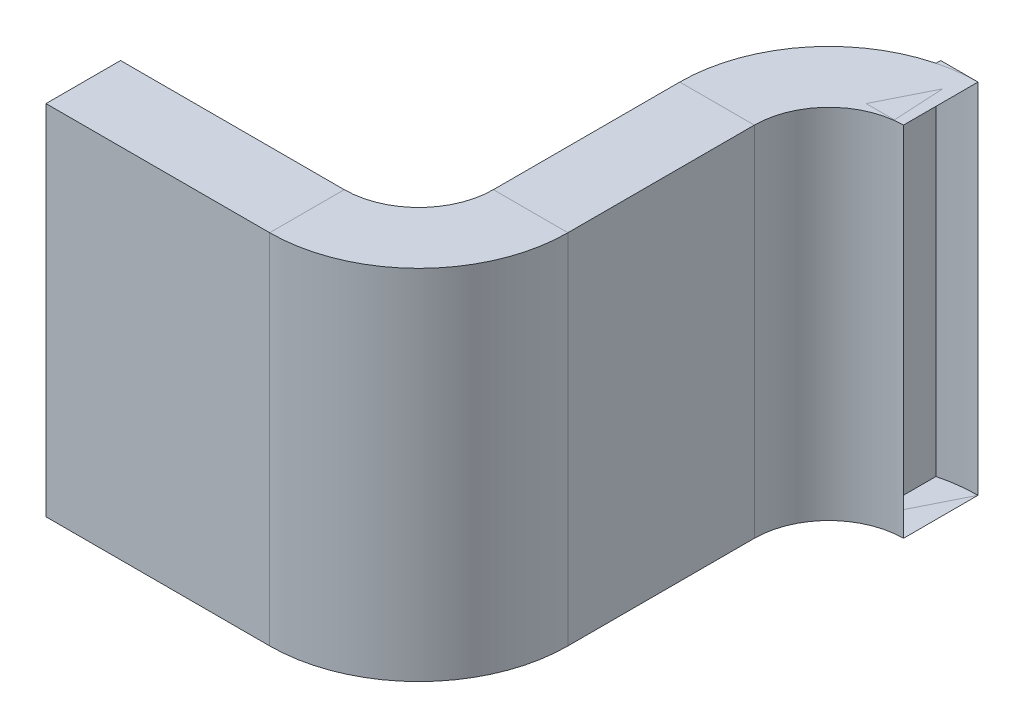
ISO-10303-21;
HEADER;
FILE_DESCRIPTION(('STEP AP214'),'2;1');
FILE_NAME('part.step','',(''),(''),'','','');
FILE_SCHEMA(('AUTOMOTIVE_DESIGN { 1 0 10303 214 1 1 1 1 }'));
ENDSEC;
DATA;
#1=APPLICATION_CONTEXT('core data for automotive mechanical design processes');
#2=APPLICATION_PROTOCOL_DEFINITION('international standard','automotive_design',2000,#1);
#3=PRODUCT_CONTEXT('',#1,'mechanical');
#4=PRODUCT('Part','Part','',(#3));
#5=PRODUCT_RELATED_PRODUCT_CATEGORY('part','',(#4));
#6=PRODUCT_DEFINITION_FORMATION('','',#4);
#7=PRODUCT_DEFINITION_CONTEXT('part definition',#1,'design');
#8=PRODUCT_DEFINITION('design','',#6,#7);
#9=PRODUCT_DEFINITION_SHAPE('','',#8);
#10=(LENGTH_UNIT() NAMED_UNIT(*) SI_UNIT(.MILLI.,.METRE.));
#11=(NAMED_UNIT(*) PLANE_ANGLE_UNIT() SI_UNIT($,.RADIAN.));
#12=(NAMED_UNIT(*) SI_UNIT($,.STERADIAN.) SOLID_ANGLE_UNIT());
#13=UNCERTAINTY_MEASURE_WITH_UNIT(LENGTH_MEASURE(1.E-05),#10,'distance_accuracy_value','');
#14=(GEOMETRIC_REPRESENTATION_CONTEXT(3) GLOBAL_UNCERTAINTY_ASSIGNED_CONTEXT((#13)) GLOBAL_UNIT_ASSIGNED_CONTEXT((#10,
#11,#12)) REPRESENTATION_CONTEXT('',''));
#15=CARTESIAN_POINT('',(0.,0.,0.));
#16=DIRECTION('',(0.,0.,1.));
#17=DIRECTION('',(1.,0.,0.));
#18=AXIS2_PLACEMENT_3D('',#15,#16,#17);
#19=CARTESIAN_POINT('',(0.55,-0.24,0.));
#20=DIRECTION('',(-1.,0.,0.));
#21=DIRECTION('',(0.,1.,0.));
#22=AXIS2_PLACEMENT_3D('',#19,#20,#21);
#23=PLANE('',#22);
#24=DIRECTION('',(0.,-1.,0.));
#25=VECTOR('',#24,1.);
#26=CARTESIAN_POINT('',(0.55,-0.24,0.));
#27=LINE('',#26,#25);
#28=CARTESIAN_POINT('',(0.55,0.24,0.));
#29=VERTEX_POINT('',#28);
#30=CARTESIAN_POINT('',(0.55,-0.24,0.));
#31=VERTEX_POINT('',#30);
#32=EDGE_CURVE('E161',#29,#31,#27,.T.);
#33=ORIENTED_EDGE('',*,*,#32,.F.);
#34=DIRECTION('',(0.,0.,-1.));
#35=VECTOR('',#34,1.);
#36=CARTESIAN_POINT('',(0.55,0.24,0.));
#37=LINE('',#36,#35);
#38=CARTESIAN_POINT('',(0.55,0.24,0.1));
#39=VERTEX_POINT('',#38);
#40=EDGE_CURVE('E11',#39,#29,#37,.T.);
#41=ORIENTED_EDGE('',*,*,#40,.F.);
#42=DIRECTION('',(0.,1.,0.));
#43=VECTOR('',#42,1.);
#44=CARTESIAN_POINT('',(0.55,0.24,0.1));
#45=LINE('',#44,#43);
#46=CARTESIAN_POINT('',(0.55,-0.24,0.1));
#47=VERTEX_POINT('',#46);
#48=EDGE_CURVE('E262',#47,#39,#45,.T.);
#49=ORIENTED_EDGE('',*,*,#48,.F.);
#50=DIRECTION('',(0.,0.,1.));
#51=VECTOR('',#50,1.);
#52=CARTESIAN_POINT('',(0.55,-0.24,0.1));
#53=LINE('',#52,#51);
#54=EDGE_CURVE('E238',#31,#47,#53,.T.);
#55=ORIENTED_EDGE('',*,*,#54,.F.);
#56=EDGE_LOOP('',(#33,#41,#49,#55));
#57=FACE_BOUND('',#56,.T.);
#58=ADVANCED_FACE('F17',(#57),#23,.F.);
#59=CARTESIAN_POINT('',(0.6,0.24,0.));
#60=DIRECTION('',(0.,1.,0.));
#61=DIRECTION('',(1.,0.,0.));
#62=AXIS2_PLACEMENT_3D('',#59,#60,#61);
#63=PLANE('',#62);
#64=ORIENTED_EDGE('',*,*,#40,.T.);
#65=DIRECTION('',(-1.,0.,0.));
#66=VECTOR('',#65,1.);
#67=CARTESIAN_POINT('',(0.6,0.24,0.));
#68=LINE('',#67,#66);
#69=CARTESIAN_POINT('',(0.6,0.24,0.));
#70=VERTEX_POINT('',#69);
#71=EDGE_CURVE('E211',#70,#29,#68,.T.);
#72=ORIENTED_EDGE('',*,*,#71,.F.);
#73=DIRECTION('',(0.,0.,-1.));
#74=VECTOR('',#73,1.);
#75=CARTESIAN_POINT('',(0.6,0.24,0.));
#76=LINE('',#75,#74);
#77=CARTESIAN_POINT('',(0.6,0.24,0.1));
#78=VERTEX_POINT('',#77);
#79=EDGE_CURVE('E21',#78,#70,#76,.T.);
#80=ORIENTED_EDGE('',*,*,#79,.F.);
#81=DIRECTION('',(-1.,0.,0.));
#82=VECTOR('',#81,1.);
#83=CARTESIAN_POINT('',(0.6,0.24,0.1));
#84=LINE('',#83,#82);
#85=EDGE_CURVE('E207',#78,#39,#84,.T.);
#86=ORIENTED_EDGE('',*,*,#85,.T.);
#87=EDGE_LOOP('',(#64,#72,#80,#86));
#88=FACE_BOUND('',#87,.T.);
#89=ADVANCED_FACE('F19',(#88),#63,.F.);
#90=CARTESIAN_POINT('',(0.493933982822,0.24,0.09393398282202));
#91=DIRECTION('',(0.,1.,0.));
#92=DIRECTION('',(1.,0.,0.));
#93=AXIS2_PLACEMENT_3D('',#90,#91,#92);
#94=PLANE('',#93);
#95=CARTESIAN_POINT('',(0.6,0.24,0.2));
#96=DIRECTION('',(0.,-1.,0.));
#97=DIRECTION('',(0.,0.,-1.));
#98=AXIS2_PLACEMENT_3D('',#95,#96,#97);
#99=CIRCLE('',#98,0.1);
#100=CARTESIAN_POINT('',(0.5,0.24,0.2));
#101=VERTEX_POINT('',#100);
#102=EDGE_CURVE('E258',#101,#78,#99,.T.);
#103=ORIENTED_EDGE('',*,*,#102,.T.);
#104=ORIENTED_EDGE('',*,*,#79,.T.);
#105=CARTESIAN_POINT('',(0.6,0.24,0.2));
#106=DIRECTION('',(0.,-1.,0.));
#107=DIRECTION('',(0.,0.,-1.));
#108=AXIS2_PLACEMENT_3D('',#105,#106,#107);
#109=CIRCLE('',#108,0.2);
#110=CARTESIAN_POINT('',(0.4,0.24,0.2));
#111=VERTEX_POINT('',#110);
#112=EDGE_CURVE('E191',#111,#70,#109,.T.);
#113=ORIENTED_EDGE('',*,*,#112,.F.);
#114=DIRECTION('',(-1.,0.,0.));
#115=VECTOR('',#114,1.);
#116=CARTESIAN_POINT('',(0.4,0.24,0.2));
#117=LINE('',#116,#115);
#118=EDGE_CURVE('E269',#101,#111,#117,.T.);
#119=ORIENTED_EDGE('',*,*,#118,.F.);
#120=EDGE_LOOP('',(#103,#104,#113,#119));
#121=FACE_BOUND('',#120,.T.);
#122=ADVANCED_FACE('F278',(#121),#94,.T.);
#123=CARTESIAN_POINT('',(0.4,0.24,0.45));
#124=DIRECTION('',(0.,-1.,0.));
#125=DIRECTION('',(0.,0.,-1.));
#126=AXIS2_PLACEMENT_3D('',#123,#124,#125);
#127=PLANE('',#126);
#128=ORIENTED_EDGE('',*,*,#118,.T.);
#129=DIRECTION('',(0.,0.,-1.));
#130=VECTOR('',#129,1.);
#131=CARTESIAN_POINT('',(0.4,0.24,0.45));
#132=LINE('',#131,#130);
#133=CARTESIAN_POINT('',(0.4,0.24,0.45));
#134=VERTEX_POINT('',#133);
#135=EDGE_CURVE('E172',#134,#111,#132,.T.);
#136=ORIENTED_EDGE('',*,*,#135,.F.);
#137=DIRECTION('',(-1.,0.,0.));
#138=VECTOR('',#137,1.);
#139=CARTESIAN_POINT('',(0.4,0.24,0.45));
#140=LINE('',#139,#138);
#141=CARTESIAN_POINT('',(0.5,0.24,0.45));
#142=VERTEX_POINT('',#141);
#143=EDGE_CURVE('E206',#142,#134,#140,.T.);
#144=ORIENTED_EDGE('',*,*,#143,.F.);
#145=DIRECTION('',(0.,0.,-1.));
#146=VECTOR('',#145,1.);
#147=CARTESIAN_POINT('',(0.5,0.24,0.45));
#148=LINE('',#147,#146);
#149=EDGE_CURVE('E251',#142,#101,#148,.T.);
#150=ORIENTED_EDGE('',*,*,#149,.T.);
#151=EDGE_LOOP('',(#128,#136,#144,#150));
#152=FACE_BOUND('',#151,.T.);
#153=ADVANCED_FACE('F346',(#152),#127,.F.);
#154=CARTESIAN_POINT('',(0.406066017178,0.24,0.556066017178));
#155=DIRECTION('',(0.,1.,0.));
#156=DIRECTION('',(1.,0.,0.));
#157=AXIS2_PLACEMENT_3D('',#154,#155,#156);
#158=PLANE('',#157);
#159=CARTESIAN_POINT('',(0.3,0.24,0.45));
#160=DIRECTION('',(0.,1.,0.));
#161=DIRECTION('',(0.,0.,-1.));
#162=AXIS2_PLACEMENT_3D('',#159,#160,#161);
#163=CIRCLE('',#162,0.2);
#164=CARTESIAN_POINT('',(0.3,0.24,0.65));
#165=VERTEX_POINT('',#164);
#166=EDGE_CURVE('E225',#165,#142,#163,.T.);
#167=ORIENTED_EDGE('',*,*,#166,.T.);
#168=ORIENTED_EDGE('',*,*,#143,.T.);
#169=CARTESIAN_POINT('',(0.3,0.24,0.45));
#170=DIRECTION('',(0.,1.,0.));
#171=DIRECTION('',(0.,0.,-1.));
#172=AXIS2_PLACEMENT_3D('',#169,#170,#171);
#173=CIRCLE('',#172,0.1);
#174=CARTESIAN_POINT('',(0.3,0.24,0.55));
#175=VERTEX_POINT('',#174);
#176=EDGE_CURVE('E178',#175,#134,#173,.T.);
#177=ORIENTED_EDGE('',*,*,#176,.F.);
#178=DIRECTION('',(0.,0.,-1.));
#179=VECTOR('',#178,1.);
#180=CARTESIAN_POINT('',(0.3,0.24,0.55));
#181=LINE('',#180,#179);
#182=EDGE_CURVE('E203',#165,#175,#181,.T.);
#183=ORIENTED_EDGE('',*,*,#182,.F.);
#184=EDGE_LOOP('',(#167,#168,#177,#183));
#185=FACE_BOUND('',#184,.T.);
#186=ADVANCED_FACE('F328',(#185),#158,.T.);
#187=CARTESIAN_POINT('',(0.,0.24,0.55));
#188=DIRECTION('',(0.,-1.,0.));
#189=DIRECTION('',(0.,0.,-1.));
#190=AXIS2_PLACEMENT_3D('',#187,#188,#189);
#191=PLANE('',#190);
#192=ORIENTED_EDGE('',*,*,#182,.T.);
#193=DIRECTION('',(1.,0.,0.));
#194=VECTOR('',#193,1.);
#195=CARTESIAN_POINT('',(0.,0.24,0.55));
#196=LINE('',#195,#194);
#197=CARTESIAN_POINT('',(0.,0.24,0.55));
#198=VERTEX_POINT('',#197);
#199=EDGE_CURVE('E295',#198,#175,#196,.T.);
#200=ORIENTED_EDGE('',*,*,#199,.F.);
#201=DIRECTION('',(0.,0.,-1.));
#202=VECTOR('',#201,1.);
#203=CARTESIAN_POINT('',(0.,0.24,0.55));
#204=LINE('',#203,#202);
#205=CARTESIAN_POINT('',(0.,0.24,0.65));
#206=VERTEX_POINT('',#205);
#207=EDGE_CURVE('E296',#206,#198,#204,.T.);
#208=ORIENTED_EDGE('',*,*,#207,.F.);
#209=DIRECTION('',(1.,0.,0.));
#210=VECTOR('',#209,1.);
#211=CARTESIAN_POINT('',(0.,0.24,0.65));
#212=LINE('',#211,#210);
#213=EDGE_CURVE('E189',#206,#165,#212,.T.);
#214=ORIENTED_EDGE('',*,*,#213,.T.);
#215=EDGE_LOOP('',(#192,#200,#208,#214));
#216=FACE_BOUND('',#215,.T.);
#217=ADVANCED_FACE('F335',(#216),#191,.F.);
#218=CARTESIAN_POINT('',(0.6,0.24,0.1));
#219=DIRECTION('',(0.,0.,1.));
#220=DIRECTION('',(1.,0.,0.));
#221=AXIS2_PLACEMENT_3D('',#218,#219,#220);
#222=PLANE('',#221);
#223=ORIENTED_EDGE('',*,*,#48,.T.);
#224=ORIENTED_EDGE('',*,*,#85,.F.);
#225=DIRECTION('',(0.,-1.,0.));
#226=VECTOR('',#225,1.);
#227=CARTESIAN_POINT('',(0.6,0.24,0.1));
#228=LINE('',#227,#226);
#229=CARTESIAN_POINT('',(0.6,-0.24,0.1));
#230=VERTEX_POINT('',#229);
#231=EDGE_CURVE('E255',#78,#230,#228,.T.);
#232=ORIENTED_EDGE('',*,*,#231,.T.);
#233=DIRECTION('',(-1.,0.,0.));
#234=VECTOR('',#233,1.);
#235=CARTESIAN_POINT('',(0.6,-0.24,0.1));
#236=LINE('',#235,#234);
#237=EDGE_CURVE('E198',#230,#47,#236,.T.);
#238=ORIENTED_EDGE('',*,*,#237,.T.);
#239=EDGE_LOOP('',(#223,#224,#232,#238));
#240=FACE_BOUND('',#239,.T.);
#241=ADVANCED_FACE('F396',(#240),#222,.F.);
#242=CARTESIAN_POINT('',(0.6,0.24,0.2));
#243=DIRECTION('',(0.,-1.,0.));
#244=DIRECTION('',(0.,0.,-1.));
#245=AXIS2_PLACEMENT_3D('',#242,#243,#244);
#246=CYLINDRICAL_SURFACE('',#245,0.1);
#247=ORIENTED_EDGE('',*,*,#231,.F.);
#248=ORIENTED_EDGE('',*,*,#102,.F.);
#249=DIRECTION('',(0.,1.,0.));
#250=VECTOR('',#249,1.);
#251=CARTESIAN_POINT('',(0.5,0.24,0.2));
#252=LINE('',#251,#250);
#253=CARTESIAN_POINT('',(0.5,-0.24,0.2));
#254=VERTEX_POINT('',#253);
#255=EDGE_CURVE('E229',#254,#101,#252,.T.);
#256=ORIENTED_EDGE('',*,*,#255,.F.);
#257=CARTESIAN_POINT('',(0.6,-0.24,0.2));
#258=DIRECTION('',(0.,-1.,0.));
#259=DIRECTION('',(0.,0.,-1.));
#260=AXIS2_PLACEMENT_3D('',#257,#258,#259);
#261=CIRCLE('',#260,0.1);
#262=EDGE_CURVE('E143',#254,#230,#261,.T.);
#263=ORIENTED_EDGE('',*,*,#262,.T.);
#264=EDGE_LOOP('',(#247,#248,#256,#263));
#265=FACE_BOUND('',#264,.T.);
#266=ADVANCED_FACE('F393',(#265),#246,.F.);
#267=CARTESIAN_POINT('',(0.5,0.24,0.45));
#268=DIRECTION('',(-1.,0.,0.));
#269=DIRECTION('',(0.,0.,1.));
#270=AXIS2_PLACEMENT_3D('',#267,#268,#269);
#271=PLANE('',#270);
#272=ORIENTED_EDGE('',*,*,#255,.T.);
#273=ORIENTED_EDGE('',*,*,#149,.F.);
#274=DIRECTION('',(0.,1.,0.));
#275=VECTOR('',#274,1.);
#276=CARTESIAN_POINT('',(0.5,0.24,0.45));
#277=LINE('',#276,#275);
#278=CARTESIAN_POINT('',(0.5,-0.24,0.45));
#279=VERTEX_POINT('',#278);
#280=EDGE_CURVE('E230',#279,#142,#277,.T.);
#281=ORIENTED_EDGE('',*,*,#280,.F.);
#282=DIRECTION('',(0.,0.,-1.));
#283=VECTOR('',#282,1.);
#284=CARTESIAN_POINT('',(0.5,-0.24,0.45));
#285=LINE('',#284,#283);
#286=EDGE_CURVE('E149',#279,#254,#285,.T.);
#287=ORIENTED_EDGE('',*,*,#286,.T.);
#288=EDGE_LOOP('',(#272,#273,#281,#287));
#289=FACE_BOUND('',#288,.T.);
#290=ADVANCED_FACE('F345',(#289),#271,.F.);
#291=CARTESIAN_POINT('',(0.3,0.24,0.45));
#292=DIRECTION('',(0.,1.,0.));
#293=DIRECTION('',(0.,0.,-1.));
#294=AXIS2_PLACEMENT_3D('',#291,#292,#293);
#295=CYLINDRICAL_SURFACE('',#294,0.2);
#296=CARTESIAN_POINT('',(0.3,-0.24,0.45));
#297=DIRECTION('',(0.,1.,0.));
#298=DIRECTION('',(0.,0.,-1.));
#299=AXIS2_PLACEMENT_3D('',#296,#297,#298);
#300=CIRCLE('',#299,0.2);
#301=CARTESIAN_POINT('',(0.3,-0.24,0.65));
#302=VERTEX_POINT('',#301);
#303=EDGE_CURVE('E150',#302,#279,#300,.T.);
#304=ORIENTED_EDGE('',*,*,#303,.T.);
#305=ORIENTED_EDGE('',*,*,#280,.T.);
#306=ORIENTED_EDGE('',*,*,#166,.F.);
#307=DIRECTION('',(0.,1.,0.));
#308=VECTOR('',#307,1.);
#309=CARTESIAN_POINT('',(0.3,0.24,0.65));
#310=LINE('',#309,#308);
#311=EDGE_CURVE('E194',#302,#165,#310,.T.);
#312=ORIENTED_EDGE('',*,*,#311,.F.);
#313=EDGE_LOOP('',(#304,#305,#306,#312));
#314=FACE_BOUND('',#313,.T.);
#315=ADVANCED_FACE('F342',(#314),#295,.T.);
#316=CARTESIAN_POINT('',(0.,0.24,0.65));
#317=DIRECTION('',(0.,0.,-1.));
#318=DIRECTION('',(0.,-1.,0.));
#319=AXIS2_PLACEMENT_3D('',#316,#317,#318);
#320=PLANE('',#319);
#321=ORIENTED_EDGE('',*,*,#311,.T.);
#322=ORIENTED_EDGE('',*,*,#213,.F.);
#323=DIRECTION('',(0.,1.,0.));
#324=VECTOR('',#323,1.);
#325=CARTESIAN_POINT('',(0.,0.24,0.65));
#326=LINE('',#325,#324);
#327=CARTESIAN_POINT('',(0.,-0.24,0.65));
#328=VERTEX_POINT('',#327);
#329=EDGE_CURVE('E291',#328,#206,#326,.T.);
#330=ORIENTED_EDGE('',*,*,#329,.F.);
#331=DIRECTION('',(1.,0.,0.));
#332=VECTOR('',#331,1.);
#333=CARTESIAN_POINT('',(0.,-0.24,0.65));
#334=LINE('',#333,#332);
#335=EDGE_CURVE('E219',#328,#302,#334,.T.);
#336=ORIENTED_EDGE('',*,*,#335,.T.);
#337=EDGE_LOOP('',(#321,#322,#330,#336));
#338=FACE_BOUND('',#337,.T.);
#339=ADVANCED_FACE('F340',(#338),#320,.F.);
#340=CARTESIAN_POINT('',(0.6,-0.24,0.1));
#341=DIRECTION('',(0.,-1.,0.));
#342=DIRECTION('',(0.,0.,-1.));
#343=AXIS2_PLACEMENT_3D('',#340,#341,#342);
#344=PLANE('',#343);
#345=ORIENTED_EDGE('',*,*,#54,.T.);
#346=ORIENTED_EDGE('',*,*,#237,.F.);
#347=DIRECTION('',(0.,0.,1.));
#348=VECTOR('',#347,1.);
#349=CARTESIAN_POINT('',(0.6,-0.24,0.1));
#350=LINE('',#349,#348);
#351=CARTESIAN_POINT('',(0.6,-0.24,0.));
#352=VERTEX_POINT('',#351);
#353=EDGE_CURVE('E233',#352,#230,#350,.T.);
#354=ORIENTED_EDGE('',*,*,#353,.F.);
#355=DIRECTION('',(-1.,0.,0.));
#356=VECTOR('',#355,1.);
#357=CARTESIAN_POINT('',(0.6,-0.24,0.));
#358=LINE('',#357,#356);
#359=EDGE_CURVE('E202',#352,#31,#358,.T.);
#360=ORIENTED_EDGE('',*,*,#359,.T.);
#361=EDGE_LOOP('',(#345,#346,#354,#360));
#362=FACE_BOUND('',#361,.T.);
#363=ADVANCED_FACE('F370',(#362),#344,.F.);
#364=CARTESIAN_POINT('',(0.493933982822,-0.24,0.09393398282202));
#365=DIRECTION('',(0.,-1.,0.));
#366=DIRECTION('',(0.,0.,-1.));
#367=AXIS2_PLACEMENT_3D('',#364,#365,#366);
#368=PLANE('',#367);
#369=CARTESIAN_POINT('',(0.6,-0.24,0.2));
#370=DIRECTION('',(0.,-1.,0.));
#371=DIRECTION('',(0.,0.,-1.));
#372=AXIS2_PLACEMENT_3D('',#369,#370,#371);
#373=CIRCLE('',#372,0.2);
#374=CARTESIAN_POINT('',(0.4,-0.24,0.2));
#375=VERTEX_POINT('',#374);
#376=EDGE_CURVE('E140',#375,#352,#373,.T.);
#377=ORIENTED_EDGE('',*,*,#376,.T.);
#378=ORIENTED_EDGE('',*,*,#353,.T.);
#379=ORIENTED_EDGE('',*,*,#262,.F.);
#380=DIRECTION('',(1.,0.,0.));
#381=VECTOR('',#380,1.);
#382=CARTESIAN_POINT('',(0.5,-0.24,0.2));
#383=LINE('',#382,#381);
#384=EDGE_CURVE('E136',#375,#254,#383,.T.);
#385=ORIENTED_EDGE('',*,*,#384,.F.);
#386=EDGE_LOOP('',(#377,#378,#379,#385));
#387=FACE_BOUND('',#386,.T.);
#388=ADVANCED_FACE('F138',(#387),#368,.T.);
#389=CARTESIAN_POINT('',(0.5,-0.24,0.45));
#390=DIRECTION('',(0.,1.,0.));
#391=DIRECTION('',(1.,0.,0.));
#392=AXIS2_PLACEMENT_3D('',#389,#390,#391);
#393=PLANE('',#392);
#394=ORIENTED_EDGE('',*,*,#384,.T.);
#395=ORIENTED_EDGE('',*,*,#286,.F.);
#396=DIRECTION('',(1.,0.,0.));
#397=VECTOR('',#396,1.);
#398=CARTESIAN_POINT('',(0.5,-0.24,0.45));
#399=LINE('',#398,#397);
#400=CARTESIAN_POINT('',(0.4,-0.24,0.45));
#401=VERTEX_POINT('',#400);
#402=EDGE_CURVE('E167',#401,#279,#399,.T.);
#403=ORIENTED_EDGE('',*,*,#402,.F.);
#404=DIRECTION('',(0.,0.,-1.));
#405=VECTOR('',#404,1.);
#406=CARTESIAN_POINT('',(0.4,-0.24,0.45));
#407=LINE('',#406,#405);
#408=EDGE_CURVE('E164',#401,#375,#407,.T.);
#409=ORIENTED_EDGE('',*,*,#408,.T.);
#410=EDGE_LOOP('',(#394,#395,#403,#409));
#411=FACE_BOUND('',#410,.T.);
#412=ADVANCED_FACE('F165',(#411),#393,.F.);
#413=CARTESIAN_POINT('',(0.406066017178,-0.24,0.556066017178));
#414=DIRECTION('',(0.,-1.,0.));
#415=DIRECTION('',(0.,0.,-1.));
#416=AXIS2_PLACEMENT_3D('',#413,#414,#415);
#417=PLANE('',#416);
#418=CARTESIAN_POINT('',(0.3,-0.24,0.45));
#419=DIRECTION('',(0.,1.,0.));
#420=DIRECTION('',(0.,0.,-1.));
#421=AXIS2_PLACEMENT_3D('',#418,#419,#420);
#422=CIRCLE('',#421,0.1);
#423=CARTESIAN_POINT('',(0.3,-0.24,0.55));
#424=VERTEX_POINT('',#423);
#425=EDGE_CURVE('E185',#424,#401,#422,.T.);
#426=ORIENTED_EDGE('',*,*,#425,.T.);
#427=ORIENTED_EDGE('',*,*,#402,.T.);
#428=ORIENTED_EDGE('',*,*,#303,.F.);
#429=DIRECTION('',(0.,0.,1.));
#430=VECTOR('',#429,1.);
#431=CARTESIAN_POINT('',(0.3,-0.24,0.65));
#432=LINE('',#431,#430);
#433=EDGE_CURVE('E215',#424,#302,#432,.T.);
#434=ORIENTED_EDGE('',*,*,#433,.F.);
#435=EDGE_LOOP('',(#426,#427,#428,#434));
#436=FACE_BOUND('',#435,.T.);
#437=ADVANCED_FACE('F320',(#436),#417,.T.);
#438=CARTESIAN_POINT('',(0.,-0.24,0.65));
#439=DIRECTION('',(0.,1.,0.));
#440=DIRECTION('',(1.,0.,0.));
#441=AXIS2_PLACEMENT_3D('',#438,#439,#440);
#442=PLANE('',#441);
#443=ORIENTED_EDGE('',*,*,#433,.T.);
#444=ORIENTED_EDGE('',*,*,#335,.F.);
#445=DIRECTION('',(0.,0.,1.));
#446=VECTOR('',#445,1.);
#447=CARTESIAN_POINT('',(0.,-0.24,0.65));
#448=LINE('',#447,#446);
#449=CARTESIAN_POINT('',(0.,-0.24,0.55));
#450=VERTEX_POINT('',#449);
#451=EDGE_CURVE('E539',#450,#328,#448,.T.);
#452=ORIENTED_EDGE('',*,*,#451,.F.);
#453=DIRECTION('',(1.,0.,0.));
#454=VECTOR('',#453,1.);
#455=CARTESIAN_POINT('',(0.,-0.24,0.55));
#456=LINE('',#455,#454);
#457=EDGE_CURVE('E304',#450,#424,#456,.T.);
#458=ORIENTED_EDGE('',*,*,#457,.T.);
#459=EDGE_LOOP('',(#443,#444,#452,#458));
#460=FACE_BOUND('',#459,.T.);
#461=ADVANCED_FACE('F365',(#460),#442,.F.);
#462=CARTESIAN_POINT('',(0.6,-0.24,0.));
#463=DIRECTION('',(0.,0.,-1.));
#464=DIRECTION('',(0.,-1.,0.));
#465=AXIS2_PLACEMENT_3D('',#462,#463,#464);
#466=PLANE('',#465);
#467=ORIENTED_EDGE('',*,*,#32,.T.);
#468=ORIENTED_EDGE('',*,*,#359,.F.);
#469=DIRECTION('',(0.,-1.,0.));
#470=VECTOR('',#469,1.);
#471=CARTESIAN_POINT('',(0.6,-0.24,0.));
#472=LINE('',#471,#470);
#473=EDGE_CURVE('E159',#70,#352,#472,.T.);
#474=ORIENTED_EDGE('',*,*,#473,.F.);
#475=ORIENTED_EDGE('',*,*,#71,.T.);
#476=EDGE_LOOP('',(#467,#468,#474,#475));
#477=FACE_BOUND('',#476,.T.);
#478=ADVANCED_FACE('F283',(#477),#466,.F.);
#479=CARTESIAN_POINT('',(0.6,-0.24,0.2));
#480=DIRECTION('',(0.,-1.,0.));
#481=DIRECTION('',(0.,0.,-1.));
#482=AXIS2_PLACEMENT_3D('',#479,#480,#481);
#483=CYLINDRICAL_SURFACE('',#482,0.2);
#484=ORIENTED_EDGE('',*,*,#112,.T.);
#485=ORIENTED_EDGE('',*,*,#473,.T.);
#486=ORIENTED_EDGE('',*,*,#376,.F.);
#487=DIRECTION('',(0.,-1.,0.));
#488=VECTOR('',#487,1.);
#489=CARTESIAN_POINT('',(0.4,-0.24,0.2));
#490=LINE('',#489,#488);
#491=EDGE_CURVE('E157',#111,#375,#490,.T.);
#492=ORIENTED_EDGE('',*,*,#491,.F.);
#493=EDGE_LOOP('',(#484,#485,#486,#492));
#494=FACE_BOUND('',#493,.T.);
#495=ADVANCED_FACE('F155',(#494),#483,.T.);
#496=CARTESIAN_POINT('',(0.4,-0.24,0.45));
#497=DIRECTION('',(1.,0.,0.));
#498=DIRECTION('',(0.,1.,0.));
#499=AXIS2_PLACEMENT_3D('',#496,#497,#498);
#500=PLANE('',#499);
#501=ORIENTED_EDGE('',*,*,#491,.T.);
#502=ORIENTED_EDGE('',*,*,#408,.F.);
#503=DIRECTION('',(0.,1.,0.));
#504=VECTOR('',#503,1.);
#505=CARTESIAN_POINT('',(0.4,-0.24,0.45));
#506=LINE('',#505,#504);
#507=EDGE_CURVE('E293',#401,#134,#506,.T.);
#508=ORIENTED_EDGE('',*,*,#507,.T.);
#509=ORIENTED_EDGE('',*,*,#135,.T.);
#510=EDGE_LOOP('',(#501,#502,#508,#509));
#511=FACE_BOUND('',#510,.T.);
#512=ADVANCED_FACE('F175',(#511),#500,.F.);
#513=CARTESIAN_POINT('',(0.3,-0.24,0.45));
#514=DIRECTION('',(0.,1.,0.));
#515=DIRECTION('',(0.,0.,-1.));
#516=AXIS2_PLACEMENT_3D('',#513,#514,#515);
#517=CYLINDRICAL_SURFACE('',#516,0.1);
#518=ORIENTED_EDGE('',*,*,#507,.F.);
#519=ORIENTED_EDGE('',*,*,#425,.F.);
#520=DIRECTION('',(0.,-1.,0.));
#521=VECTOR('',#520,1.);
#522=CARTESIAN_POINT('',(0.3,-0.24,0.55));
#523=LINE('',#522,#521);
#524=EDGE_CURVE('E311',#175,#424,#523,.T.);
#525=ORIENTED_EDGE('',*,*,#524,.F.);
#526=ORIENTED_EDGE('',*,*,#176,.T.);
#527=EDGE_LOOP('',(#518,#519,#525,#526));
#528=FACE_BOUND('',#527,.T.);
#529=ADVANCED_FACE('F325',(#528),#517,.F.);
#530=CARTESIAN_POINT('',(0.,-0.24,0.55));
#531=DIRECTION('',(0.,0.,1.));
#532=DIRECTION('',(1.,0.,0.));
#533=AXIS2_PLACEMENT_3D('',#530,#531,#532);
#534=PLANE('',#533);
#535=ORIENTED_EDGE('',*,*,#524,.T.);
#536=ORIENTED_EDGE('',*,*,#457,.F.);
#537=DIRECTION('',(0.,-1.,0.));
#538=VECTOR('',#537,1.);
#539=CARTESIAN_POINT('',(0.,-0.24,0.55));
#540=LINE('',#539,#538);
#541=EDGE_CURVE('E299',#198,#450,#540,.T.);
#542=ORIENTED_EDGE('',*,*,#541,.F.);
#543=ORIENTED_EDGE('',*,*,#199,.T.);
#544=EDGE_LOOP('',(#535,#536,#542,#543));
#545=FACE_BOUND('',#544,.T.);
#546=ADVANCED_FACE('F332',(#545),#534,.F.);
#547=CARTESIAN_POINT('',(0.,-0.24,0.55));
#548=DIRECTION('',(-1.,0.,0.));
#549=DIRECTION('',(0.,0.,1.));
#550=AXIS2_PLACEMENT_3D('',#547,#548,#549);
#551=PLANE('',#550);
#552=ORIENTED_EDGE('',*,*,#451,.T.);
#553=ORIENTED_EDGE('',*,*,#329,.T.);
#554=ORIENTED_EDGE('',*,*,#207,.T.);
#555=ORIENTED_EDGE('',*,*,#541,.T.);
#556=EDGE_LOOP('',(#552,#553,#554,#555));
#557=FACE_BOUND('',#556,.T.);
#558=ADVANCED_FACE('F362',(#557),#551,.T.);
#559=CLOSED_SHELL('',(#58,#89,#122,#153,#186,#217,#241,#266,#290,#315,#339,#363,#388,#412,#437,
#461,#478,#495,#512,#529,#546,#558));
#560=MANIFOLD_SOLID_BREP('B1',#559);
#561=ADVANCED_BREP_SHAPE_REPRESENTATION('',(#18,#560),#14);
#562=SHAPE_DEFINITION_REPRESENTATION(#9,#561);
ENDSEC;
END-ISO-10303-21;
